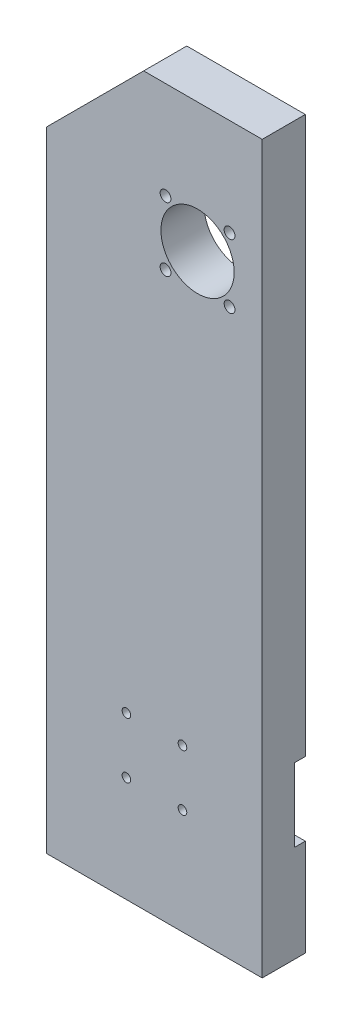
ISO-10303-21;
HEADER;
FILE_DESCRIPTION(('STEP AP214'),'2;1');
FILE_NAME('part.step','',(''),(''),'','','');
FILE_SCHEMA(('AUTOMOTIVE_DESIGN { 1 0 10303 214 1 1 1 1 }'));
ENDSEC;
DATA;
#1=APPLICATION_CONTEXT('core data for automotive mechanical design processes');
#2=APPLICATION_PROTOCOL_DEFINITION('international standard','automotive_design',2000,#1);
#3=PRODUCT_CONTEXT('',#1,'mechanical');
#4=PRODUCT('Part','Part','',(#3));
#5=PRODUCT_RELATED_PRODUCT_CATEGORY('part','',(#4));
#6=PRODUCT_DEFINITION_FORMATION('','',#4);
#7=PRODUCT_DEFINITION_CONTEXT('part definition',#1,'design');
#8=PRODUCT_DEFINITION('design','',#6,#7);
#9=PRODUCT_DEFINITION_SHAPE('','',#8);
#10=(LENGTH_UNIT() NAMED_UNIT(*) SI_UNIT(.MILLI.,.METRE.));
#11=(NAMED_UNIT(*) PLANE_ANGLE_UNIT() SI_UNIT($,.RADIAN.));
#12=(NAMED_UNIT(*) SI_UNIT($,.STERADIAN.) SOLID_ANGLE_UNIT());
#13=UNCERTAINTY_MEASURE_WITH_UNIT(LENGTH_MEASURE(1.E-05),#10,'distance_accuracy_value','');
#14=(GEOMETRIC_REPRESENTATION_CONTEXT(3) GLOBAL_UNCERTAINTY_ASSIGNED_CONTEXT((#13)) GLOBAL_UNIT_ASSIGNED_CONTEXT((#10,
#11,#12)) REPRESENTATION_CONTEXT('',''));
#15=CARTESIAN_POINT('',(0.,0.,0.));
#16=DIRECTION('',(0.,0.,1.));
#17=DIRECTION('',(1.,0.,0.));
#18=AXIS2_PLACEMENT_3D('',#15,#16,#17);
#19=CARTESIAN_POINT('',(0.,0.,0.));
#20=DIRECTION('',(0.,0.,1.));
#21=DIRECTION('',(1.,0.,0.));
#22=AXIS2_PLACEMENT_3D('',#19,#20,#21);
#23=PLANE('',#22);
#24=DIRECTION('',(1.,0.,0.));
#25=VECTOR('',#24,1.);
#26=CARTESIAN_POINT('',(97.7045460620289,328.500370418681,0.));
#27=LINE('',#26,#25);
#28=CARTESIAN_POINT('',(-2.29545393797106,328.500370418681,0.));
#29=VERTEX_POINT('',#28);
#30=CARTESIAN_POINT('',(97.7045460620289,328.500370418681,0.));
#31=VERTEX_POINT('',#30);
#32=EDGE_CURVE('E118',#29,#31,#27,.T.);
#33=ORIENTED_EDGE('',*,*,#32,.T.);
#34=DIRECTION('',(0.,1.,0.));
#35=VECTOR('',#34,1.);
#36=CARTESIAN_POINT('',(97.7045460620289,283.500370418681,0.));
#37=LINE('',#36,#35);
#38=CARTESIAN_POINT('',(97.7045460620289,283.500370418681,0.));
#39=VERTEX_POINT('',#38);
#40=EDGE_CURVE('E206',#39,#31,#37,.T.);
#41=ORIENTED_EDGE('',*,*,#40,.F.);
#42=DIRECTION('',(1.,0.,0.));
#43=VECTOR('',#42,1.);
#44=CARTESIAN_POINT('',(97.7045460620289,283.500370418681,0.));
#45=LINE('',#44,#43);
#46=CARTESIAN_POINT('',(-2.29545393797106,283.500370418681,0.));
#47=VERTEX_POINT('',#46);
#48=EDGE_CURVE('E203',#47,#39,#45,.T.);
#49=ORIENTED_EDGE('',*,*,#48,.F.);
#50=DIRECTION('',(0.,-1.,0.));
#51=VECTOR('',#50,1.);
#52=CARTESIAN_POINT('',(-2.29545393797106,283.500370418681,0.));
#53=LINE('',#52,#51);
#54=EDGE_CURVE('E188',#29,#47,#53,.T.);
#55=ORIENTED_EDGE('',*,*,#54,.F.);
#56=EDGE_LOOP('',(#33,#41,#49,#55));
#57=FACE_BOUND('',#56,.T.);
#58=ADVANCED_FACE('F33',(#57),#23,.F.);
#59=CARTESIAN_POINT('',(52.8553036571115,575.349612823599,0.));
#60=DIRECTION('',(0.,0.,1.));
#61=DIRECTION('',(1.,0.,0.));
#62=AXIS2_PLACEMENT_3D('',#59,#60,#61);
#63=CIRCLE('',#62,2.50000000000003);
#64=CARTESIAN_POINT('',(55.3553036571115,575.349612823599,0.));
#65=VERTEX_POINT('',#64);
#66=EDGE_CURVE('E160',#65,#65,#63,.T.);
#67=ORIENTED_EDGE('',*,*,#66,.T.);
#68=EDGE_LOOP('',(#67));
#69=FACE_BOUND('',#68,.T.);
#70=CARTESIAN_POINT('',(52.8553036571115,545.651128013763,0.));
#71=DIRECTION('',(0.,0.,1.));
#72=DIRECTION('',(1.,0.,0.));
#73=AXIS2_PLACEMENT_3D('',#70,#71,#72);
#74=CIRCLE('',#73,2.5);
#75=CARTESIAN_POINT('',(55.3553036571115,545.651128013763,0.));
#76=VERTEX_POINT('',#75);
#77=EDGE_CURVE('E164',#76,#76,#74,.T.);
#78=ORIENTED_EDGE('',*,*,#77,.T.);
#79=EDGE_LOOP('',(#78));
#80=FACE_BOUND('',#79,.T.);
#81=CARTESIAN_POINT('',(82.5537884669464,545.651128013763,0.));
#82=DIRECTION('',(0.,0.,1.));
#83=DIRECTION('',(1.,0.,0.));
#84=AXIS2_PLACEMENT_3D('',#81,#82,#83);
#85=CIRCLE('',#84,2.50000000000001);
#86=CARTESIAN_POINT('',(85.0537884669464,545.651128013763,0.));
#87=VERTEX_POINT('',#86);
#88=EDGE_CURVE('E170',#87,#87,#85,.T.);
#89=ORIENTED_EDGE('',*,*,#88,.T.);
#90=EDGE_LOOP('',(#89));
#91=FACE_BOUND('',#90,.T.);
#92=CARTESIAN_POINT('',(82.5537884669464,575.349612823599,0.));
#93=DIRECTION('',(0.,0.,1.));
#94=DIRECTION('',(1.,0.,0.));
#95=AXIS2_PLACEMENT_3D('',#92,#93,#94);
#96=CIRCLE('',#95,2.50000000000001);
#97=CARTESIAN_POINT('',(85.0537884669464,575.349612823599,0.));
#98=VERTEX_POINT('',#97);
#99=EDGE_CURVE('E176',#98,#98,#96,.T.);
#100=ORIENTED_EDGE('',*,*,#99,.T.);
#101=EDGE_LOOP('',(#100));
#102=FACE_BOUND('',#101,.T.);
#103=CARTESIAN_POINT('',(67.7045460620289,560.500370418681,0.));
#104=DIRECTION('',(0.,0.,1.));
#105=DIRECTION('',(1.,0.,0.));
#106=AXIS2_PLACEMENT_3D('',#103,#104,#105);
#107=CIRCLE('',#106,17.0000000000001);
#108=CARTESIAN_POINT('',(84.704546062029,560.500370418681,0.));
#109=VERTEX_POINT('',#108);
#110=EDGE_CURVE('E182',#109,#109,#107,.T.);
#111=ORIENTED_EDGE('',*,*,#110,.T.);
#112=EDGE_LOOP('',(#111));
#113=FACE_BOUND('',#112,.T.);
#114=DIRECTION('',(-1.,0.,0.));
#115=VECTOR('',#114,1.);
#116=CARTESIAN_POINT('',(97.704546062029,362.500370418681,0.));
#117=LINE('',#116,#115);
#118=CARTESIAN_POINT('',(97.704546062029,362.500370418681,0.));
#119=VERTEX_POINT('',#118);
#120=CARTESIAN_POINT('',(-2.29545393797106,362.500370418681,0.));
#121=VERTEX_POINT('',#120);
#122=EDGE_CURVE('E126',#119,#121,#117,.T.);
#123=ORIENTED_EDGE('',*,*,#122,.T.);
#124=CARTESIAN_POINT('',(-2.29545393797106,575.500370418681,0.));
#125=VERTEX_POINT('',#124);
#126=EDGE_CURVE('E201',#125,#121,#53,.T.);
#127=ORIENTED_EDGE('',*,*,#126,.F.);
#128=DIRECTION('',(-0.707106781186548,-0.707106781186547,0.));
#129=VECTOR('',#128,1.);
#130=CARTESIAN_POINT('',(-2.29545393797106,575.500370418681,0.));
#131=LINE('',#130,#129);
#132=CARTESIAN_POINT('',(42.704546062029,620.500370418681,0.));
#133=VERTEX_POINT('',#132);
#134=EDGE_CURVE('E221',#125,#133,#131,.F.);
#135=ORIENTED_EDGE('',*,*,#134,.T.);
#136=DIRECTION('',(-1.,0.,0.));
#137=VECTOR('',#136,1.);
#138=CARTESIAN_POINT('',(97.7045460620289,620.500370418681,0.));
#139=LINE('',#138,#137);
#140=CARTESIAN_POINT('',(97.7045460620289,620.500370418681,0.));
#141=VERTEX_POINT('',#140);
#142=EDGE_CURVE('E194',#141,#133,#139,.T.);
#143=ORIENTED_EDGE('',*,*,#142,.F.);
#144=EDGE_CURVE('E205',#119,#141,#37,.T.);
#145=ORIENTED_EDGE('',*,*,#144,.F.);
#146=EDGE_LOOP('',(#123,#127,#135,#143,#145));
#147=FACE_BOUND('',#146,.T.);
#148=ADVANCED_FACE('F226',(#69,#80,#91,#102,#113,#147),#23,.F.);
#149=CARTESIAN_POINT('',(-2.29545393797106,283.500370418681,20.));
#150=DIRECTION('',(1.,0.,0.));
#151=DIRECTION('',(0.,0.,-1.));
#152=AXIS2_PLACEMENT_3D('',#149,#150,#151);
#153=PLANE('',#152);
#154=DIRECTION('',(0.,0.,-1.));
#155=VECTOR('',#154,1.);
#156=CARTESIAN_POINT('',(-2.29545393797106,328.500370418681,5.));
#157=LINE('',#156,#155);
#158=CARTESIAN_POINT('',(-2.29545393797106,328.500370418681,5.));
#159=VERTEX_POINT('',#158);
#160=EDGE_CURVE('E115',#159,#29,#157,.T.);
#161=ORIENTED_EDGE('',*,*,#160,.T.);
#162=ORIENTED_EDGE('',*,*,#54,.T.);
#163=DIRECTION('',(0.,0.,-1.));
#164=VECTOR('',#163,1.);
#165=CARTESIAN_POINT('',(-2.29545393797106,283.500370418681,20.));
#166=LINE('',#165,#164);
#167=CARTESIAN_POINT('',(-2.29545393797106,283.500370418681,20.));
#168=VERTEX_POINT('',#167);
#169=EDGE_CURVE('E215',#168,#47,#166,.T.);
#170=ORIENTED_EDGE('',*,*,#169,.F.);
#171=DIRECTION('',(0.,-1.,0.));
#172=VECTOR('',#171,1.);
#173=CARTESIAN_POINT('',(-2.29545393797106,283.500370418681,20.));
#174=LINE('',#173,#172);
#175=CARTESIAN_POINT('',(-2.29545393797102,575.500370418681,20.));
#176=VERTEX_POINT('',#175);
#177=EDGE_CURVE('E191',#176,#168,#174,.T.);
#178=ORIENTED_EDGE('',*,*,#177,.F.);
#179=DIRECTION('',(0.,0.,-1.));
#180=VECTOR('',#179,1.);
#181=CARTESIAN_POINT('',(-2.29545393797106,575.500370418681,20.));
#182=LINE('',#181,#180);
#183=EDGE_CURVE('E218',#176,#125,#182,.T.);
#184=ORIENTED_EDGE('',*,*,#183,.T.);
#185=ORIENTED_EDGE('',*,*,#126,.T.);
#186=DIRECTION('',(0.,0.,-1.));
#187=VECTOR('',#186,1.);
#188=CARTESIAN_POINT('',(-2.29545393797106,362.500370418681,5.));
#189=LINE('',#188,#187);
#190=CARTESIAN_POINT('',(-2.29545393797106,362.500370418681,5.));
#191=VERTEX_POINT('',#190);
#192=EDGE_CURVE('E125',#191,#121,#189,.T.);
#193=ORIENTED_EDGE('',*,*,#192,.F.);
#194=DIRECTION('',(0.,-1.,0.));
#195=VECTOR('',#194,1.);
#196=CARTESIAN_POINT('',(-2.29545393797106,328.500370418681,5.));
#197=LINE('',#196,#195);
#198=EDGE_CURVE('E107',#191,#159,#197,.T.);
#199=ORIENTED_EDGE('',*,*,#198,.T.);
#200=EDGE_LOOP('',(#161,#162,#170,#178,#184,#185,#193,#199));
#201=FACE_BOUND('',#200,.T.);
#202=ADVANCED_FACE('F123',(#201),#153,.F.);
#203=CARTESIAN_POINT('',(97.7045460620289,283.500370418681,20.));
#204=DIRECTION('',(-1.,0.,0.));
#205=DIRECTION('',(0.,0.,1.));
#206=AXIS2_PLACEMENT_3D('',#203,#204,#205);
#207=PLANE('',#206);
#208=DIRECTION('',(0.,0.,-1.));
#209=VECTOR('',#208,1.);
#210=CARTESIAN_POINT('',(97.7045460620289,328.500370418681,5.));
#211=LINE('',#210,#209);
#212=CARTESIAN_POINT('',(97.7045460620289,328.500370418681,5.));
#213=VERTEX_POINT('',#212);
#214=EDGE_CURVE('E121',#213,#31,#211,.T.);
#215=ORIENTED_EDGE('',*,*,#214,.F.);
#216=DIRECTION('',(0.,1.,0.));
#217=VECTOR('',#216,1.);
#218=CARTESIAN_POINT('',(97.7045460620289,328.500370418681,5.));
#219=LINE('',#218,#217);
#220=CARTESIAN_POINT('',(97.7045460620289,362.500370418681,5.));
#221=VERTEX_POINT('',#220);
#222=EDGE_CURVE('E110',#213,#221,#219,.T.);
#223=ORIENTED_EDGE('',*,*,#222,.T.);
#224=DIRECTION('',(0.,0.,-1.));
#225=VECTOR('',#224,1.);
#226=CARTESIAN_POINT('',(97.704546062029,362.500370418681,5.));
#227=LINE('',#226,#225);
#228=EDGE_CURVE('E135',#221,#119,#227,.T.);
#229=ORIENTED_EDGE('',*,*,#228,.T.);
#230=ORIENTED_EDGE('',*,*,#144,.T.);
#231=DIRECTION('',(0.,0.,-1.));
#232=VECTOR('',#231,1.);
#233=CARTESIAN_POINT('',(97.7045460620289,620.500370418681,20.));
#234=LINE('',#233,#232);
#235=CARTESIAN_POINT('',(97.7045460620289,620.500370418681,20.));
#236=VERTEX_POINT('',#235);
#237=EDGE_CURVE('E200',#236,#141,#234,.T.);
#238=ORIENTED_EDGE('',*,*,#237,.F.);
#239=DIRECTION('',(0.,1.,0.));
#240=VECTOR('',#239,1.);
#241=CARTESIAN_POINT('',(97.7045460620289,283.500370418681,20.));
#242=LINE('',#241,#240);
#243=CARTESIAN_POINT('',(97.7045460620289,283.500370418681,20.));
#244=VERTEX_POINT('',#243);
#245=EDGE_CURVE('E196',#244,#236,#242,.T.);
#246=ORIENTED_EDGE('',*,*,#245,.F.);
#247=DIRECTION('',(0.,0.,-1.));
#248=VECTOR('',#247,1.);
#249=CARTESIAN_POINT('',(97.7045460620289,283.500370418681,20.));
#250=LINE('',#249,#248);
#251=EDGE_CURVE('E212',#244,#39,#250,.T.);
#252=ORIENTED_EDGE('',*,*,#251,.T.);
#253=ORIENTED_EDGE('',*,*,#40,.T.);
#254=EDGE_LOOP('',(#215,#223,#229,#230,#238,#246,#252,#253));
#255=FACE_BOUND('',#254,.T.);
#256=ADVANCED_FACE('F245',(#255),#207,.F.);
#257=CARTESIAN_POINT('',(0.,0.,20.));
#258=DIRECTION('',(0.,0.,1.));
#259=DIRECTION('',(1.,0.,0.));
#260=AXIS2_PLACEMENT_3D('',#257,#258,#259);
#261=PLANE('',#260);
#262=CARTESIAN_POINT('',(60.7045460620289,332.500370418681,20.));
#263=DIRECTION('',(0.,0.,1.));
#264=DIRECTION('',(1.,0.,0.));
#265=AXIS2_PLACEMENT_3D('',#262,#263,#264);
#266=CIRCLE('',#265,2.);
#267=CARTESIAN_POINT('',(62.7045460620289,332.500370418681,20.));
#268=VERTEX_POINT('',#267);
#269=EDGE_CURVE('E151',#268,#268,#266,.T.);
#270=ORIENTED_EDGE('',*,*,#269,.F.);
#271=EDGE_LOOP('',(#270));
#272=FACE_BOUND('',#271,.T.);
#273=CARTESIAN_POINT('',(34.7045460620289,358.500370418681,20.));
#274=DIRECTION('',(0.,0.,1.));
#275=DIRECTION('',(1.,0.,0.));
#276=AXIS2_PLACEMENT_3D('',#273,#274,#275);
#277=CIRCLE('',#276,2.00000000000001);
#278=CARTESIAN_POINT('',(36.7045460620289,358.500370418681,20.));
#279=VERTEX_POINT('',#278);
#280=EDGE_CURVE('E157',#279,#279,#277,.T.);
#281=ORIENTED_EDGE('',*,*,#280,.F.);
#282=EDGE_LOOP('',(#281));
#283=FACE_BOUND('',#282,.T.);
#284=CARTESIAN_POINT('',(52.8553036571115,545.651128013763,20.));
#285=DIRECTION('',(0.,0.,1.));
#286=DIRECTION('',(1.,0.,0.));
#287=AXIS2_PLACEMENT_3D('',#284,#285,#286);
#288=CIRCLE('',#287,2.5);
#289=CARTESIAN_POINT('',(55.3553036571115,545.651128013763,20.));
#290=VERTEX_POINT('',#289);
#291=EDGE_CURVE('E167',#290,#290,#288,.T.);
#292=ORIENTED_EDGE('',*,*,#291,.F.);
#293=EDGE_LOOP('',(#292));
#294=FACE_BOUND('',#293,.T.);
#295=CARTESIAN_POINT('',(82.5537884669464,575.349612823599,20.));
#296=DIRECTION('',(0.,0.,1.));
#297=DIRECTION('',(1.,0.,0.));
#298=AXIS2_PLACEMENT_3D('',#295,#296,#297);
#299=CIRCLE('',#298,2.50000000000001);
#300=CARTESIAN_POINT('',(85.0537884669464,575.349612823599,20.));
#301=VERTEX_POINT('',#300);
#302=EDGE_CURVE('E179',#301,#301,#299,.T.);
#303=ORIENTED_EDGE('',*,*,#302,.F.);
#304=EDGE_LOOP('',(#303));
#305=FACE_BOUND('',#304,.T.);
#306=DIRECTION('',(-1.,0.,0.));
#307=VECTOR('',#306,1.);
#308=CARTESIAN_POINT('',(97.7045460620289,620.500370418681,20.));
#309=LINE('',#308,#307);
#310=CARTESIAN_POINT('',(42.7045460620291,620.500370418681,20.));
#311=VERTEX_POINT('',#310);
#312=EDGE_CURVE('E198',#236,#311,#309,.T.);
#313=ORIENTED_EDGE('',*,*,#312,.T.);
#314=DIRECTION('',(0.707106781186548,0.707106781186547,0.));
#315=VECTOR('',#314,1.);
#316=CARTESIAN_POINT('',(-288.897912178326,288.897912178326,20.));
#317=LINE('',#316,#315);
#318=EDGE_CURVE('E11',#311,#176,#317,.F.);
#319=ORIENTED_EDGE('',*,*,#318,.T.);
#320=ORIENTED_EDGE('',*,*,#177,.T.);
#321=DIRECTION('',(1.,0.,0.));
#322=VECTOR('',#321,1.);
#323=CARTESIAN_POINT('',(97.7045460620289,283.500370418681,20.));
#324=LINE('',#323,#322);
#325=EDGE_CURVE('E193',#168,#244,#324,.T.);
#326=ORIENTED_EDGE('',*,*,#325,.T.);
#327=ORIENTED_EDGE('',*,*,#245,.T.);
#328=EDGE_LOOP('',(#313,#319,#320,#326,#327));
#329=FACE_BOUND('',#328,.T.);
#330=CARTESIAN_POINT('',(67.7045460620289,560.500370418681,20.));
#331=DIRECTION('',(0.,0.,1.));
#332=DIRECTION('',(1.,0.,0.));
#333=AXIS2_PLACEMENT_3D('',#330,#331,#332);
#334=CIRCLE('',#333,17.0000000000001);
#335=CARTESIAN_POINT('',(84.704546062029,560.500370418681,20.));
#336=VERTEX_POINT('',#335);
#337=EDGE_CURVE('E185',#336,#336,#334,.T.);
#338=ORIENTED_EDGE('',*,*,#337,.F.);
#339=EDGE_LOOP('',(#338));
#340=FACE_BOUND('',#339,.T.);
#341=CARTESIAN_POINT('',(82.5537884669464,545.651128013763,20.));
#342=DIRECTION('',(0.,0.,1.));
#343=DIRECTION('',(1.,0.,0.));
#344=AXIS2_PLACEMENT_3D('',#341,#342,#343);
#345=CIRCLE('',#344,2.50000000000001);
#346=CARTESIAN_POINT('',(85.0537884669464,545.651128013763,20.));
#347=VERTEX_POINT('',#346);
#348=EDGE_CURVE('E173',#347,#347,#345,.T.);
#349=ORIENTED_EDGE('',*,*,#348,.F.);
#350=EDGE_LOOP('',(#349));
#351=FACE_BOUND('',#350,.T.);
#352=CARTESIAN_POINT('',(52.8553036571115,575.349612823599,20.));
#353=DIRECTION('',(0.,0.,1.));
#354=DIRECTION('',(1.,0.,0.));
#355=AXIS2_PLACEMENT_3D('',#352,#353,#354);
#356=CIRCLE('',#355,2.50000000000003);
#357=CARTESIAN_POINT('',(55.3553036571115,575.349612823599,20.));
#358=VERTEX_POINT('',#357);
#359=EDGE_CURVE('E161',#358,#358,#356,.T.);
#360=ORIENTED_EDGE('',*,*,#359,.F.);
#361=EDGE_LOOP('',(#360));
#362=FACE_BOUND('',#361,.T.);
#363=CARTESIAN_POINT('',(60.7045460620289,358.500370418681,20.));
#364=DIRECTION('',(0.,0.,1.));
#365=DIRECTION('',(-1.,0.,0.));
#366=AXIS2_PLACEMENT_3D('',#363,#364,#365);
#367=CIRCLE('',#366,2.);
#368=CARTESIAN_POINT('',(58.7045460620289,358.500370418681,20.));
#369=VERTEX_POINT('',#368);
#370=EDGE_CURVE('E154',#369,#369,#367,.T.);
#371=ORIENTED_EDGE('',*,*,#370,.F.);
#372=EDGE_LOOP('',(#371));
#373=FACE_BOUND('',#372,.T.);
#374=CARTESIAN_POINT('',(34.7045460620289,332.500370418681,20.));
#375=DIRECTION('',(0.,0.,1.));
#376=DIRECTION('',(-1.,0.,0.));
#377=AXIS2_PLACEMENT_3D('',#374,#375,#376);
#378=CIRCLE('',#377,2.00000000000001);
#379=CARTESIAN_POINT('',(32.7045460620289,332.500370418681,20.));
#380=VERTEX_POINT('',#379);
#381=EDGE_CURVE('E148',#380,#380,#378,.T.);
#382=ORIENTED_EDGE('',*,*,#381,.F.);
#383=EDGE_LOOP('',(#382));
#384=FACE_BOUND('',#383,.T.);
#385=ADVANCED_FACE('F235',(#272,#283,#294,#305,#329,#340,#351,#362,#373,#384),#261,.T.);
#386=CARTESIAN_POINT('',(97.7045460620289,283.500370418681,20.));
#387=DIRECTION('',(0.,1.,0.));
#388=DIRECTION('',(0.,0.,1.));
#389=AXIS2_PLACEMENT_3D('',#386,#387,#388);
#390=PLANE('',#389);
#391=ORIENTED_EDGE('',*,*,#48,.T.);
#392=ORIENTED_EDGE('',*,*,#251,.F.);
#393=ORIENTED_EDGE('',*,*,#325,.F.);
#394=ORIENTED_EDGE('',*,*,#169,.T.);
#395=EDGE_LOOP('',(#391,#392,#393,#394));
#396=FACE_BOUND('',#395,.T.);
#397=ADVANCED_FACE('F241',(#396),#390,.F.);
#398=CARTESIAN_POINT('',(97.7045460620289,620.500370418681,20.));
#399=DIRECTION('',(0.,-1.,0.));
#400=DIRECTION('',(0.,0.,-1.));
#401=AXIS2_PLACEMENT_3D('',#398,#399,#400);
#402=PLANE('',#401);
#403=ORIENTED_EDGE('',*,*,#142,.T.);
#404=DIRECTION('',(0.,0.,1.));
#405=VECTOR('',#404,1.);
#406=CARTESIAN_POINT('',(42.704546062029,620.500370418681,20.));
#407=LINE('',#406,#405);
#408=EDGE_CURVE('E42',#133,#311,#407,.T.);
#409=ORIENTED_EDGE('',*,*,#408,.T.);
#410=ORIENTED_EDGE('',*,*,#312,.F.);
#411=ORIENTED_EDGE('',*,*,#237,.T.);
#412=EDGE_LOOP('',(#403,#409,#410,#411));
#413=FACE_BOUND('',#412,.T.);
#414=ADVANCED_FACE('F230',(#413),#402,.F.);
#415=CARTESIAN_POINT('',(67.7045460620289,560.500370418681,20.));
#416=DIRECTION('',(0.,0.,-1.));
#417=DIRECTION('',(-1.,0.,0.));
#418=AXIS2_PLACEMENT_3D('',#415,#416,#417);
#419=CYLINDRICAL_SURFACE('',#418,17.0000000000001);
#420=ORIENTED_EDGE('',*,*,#337,.T.);
#421=EDGE_LOOP('',(#420));
#422=FACE_BOUND('',#421,.T.);
#423=ORIENTED_EDGE('',*,*,#110,.F.);
#424=EDGE_LOOP('',(#423));
#425=FACE_BOUND('',#424,.T.);
#426=ADVANCED_FACE('F261',(#422,#425),#419,.F.);
#427=CARTESIAN_POINT('',(82.5537884669464,575.349612823599,20.));
#428=DIRECTION('',(0.,0.,-1.));
#429=DIRECTION('',(-1.,0.,0.));
#430=AXIS2_PLACEMENT_3D('',#427,#428,#429);
#431=CYLINDRICAL_SURFACE('',#430,2.50000000000001);
#432=ORIENTED_EDGE('',*,*,#302,.T.);
#433=EDGE_LOOP('',(#432));
#434=FACE_BOUND('',#433,.T.);
#435=ORIENTED_EDGE('',*,*,#99,.F.);
#436=EDGE_LOOP('',(#435));
#437=FACE_BOUND('',#436,.T.);
#438=ADVANCED_FACE('F297',(#434,#437),#431,.F.);
#439=CARTESIAN_POINT('',(82.5537884669464,545.651128013763,20.));
#440=DIRECTION('',(0.,0.,-1.));
#441=DIRECTION('',(-1.,0.,0.));
#442=AXIS2_PLACEMENT_3D('',#439,#440,#441);
#443=CYLINDRICAL_SURFACE('',#442,2.50000000000001);
#444=ORIENTED_EDGE('',*,*,#348,.T.);
#445=EDGE_LOOP('',(#444));
#446=FACE_BOUND('',#445,.T.);
#447=ORIENTED_EDGE('',*,*,#88,.F.);
#448=EDGE_LOOP('',(#447));
#449=FACE_BOUND('',#448,.T.);
#450=ADVANCED_FACE('F304',(#446,#449),#443,.F.);
#451=CARTESIAN_POINT('',(52.8553036571115,545.651128013763,20.));
#452=DIRECTION('',(0.,0.,-1.));
#453=DIRECTION('',(-1.,0.,0.));
#454=AXIS2_PLACEMENT_3D('',#451,#452,#453);
#455=CYLINDRICAL_SURFACE('',#454,2.5);
#456=ORIENTED_EDGE('',*,*,#291,.T.);
#457=EDGE_LOOP('',(#456));
#458=FACE_BOUND('',#457,.T.);
#459=ORIENTED_EDGE('',*,*,#77,.F.);
#460=EDGE_LOOP('',(#459));
#461=FACE_BOUND('',#460,.T.);
#462=ADVANCED_FACE('F312',(#458,#461),#455,.F.);
#463=CARTESIAN_POINT('',(52.8553036571115,575.349612823599,20.));
#464=DIRECTION('',(0.,0.,-1.));
#465=DIRECTION('',(-1.,0.,0.));
#466=AXIS2_PLACEMENT_3D('',#463,#464,#465);
#467=CYLINDRICAL_SURFACE('',#466,2.50000000000003);
#468=ORIENTED_EDGE('',*,*,#359,.T.);
#469=EDGE_LOOP('',(#468));
#470=FACE_BOUND('',#469,.T.);
#471=ORIENTED_EDGE('',*,*,#66,.F.);
#472=EDGE_LOOP('',(#471));
#473=FACE_BOUND('',#472,.T.);
#474=ADVANCED_FACE('F320',(#470,#473),#467,.F.);
#475=CARTESIAN_POINT('',(34.7045460620289,358.500370418681,20.));
#476=DIRECTION('',(0.,0.,-1.));
#477=DIRECTION('',(-1.,0.,0.));
#478=AXIS2_PLACEMENT_3D('',#475,#476,#477);
#479=CYLINDRICAL_SURFACE('',#478,2.00000000000001);
#480=CARTESIAN_POINT('',(34.7045460620289,358.500370418681,5.));
#481=DIRECTION('',(0.,0.,1.));
#482=DIRECTION('',(1.,0.,0.));
#483=AXIS2_PLACEMENT_3D('',#480,#481,#482);
#484=CIRCLE('',#483,2.00000000000001);
#485=CARTESIAN_POINT('',(36.7045460620289,358.500370418681,5.));
#486=VERTEX_POINT('',#485);
#487=EDGE_CURVE('E145',#486,#486,#484,.T.);
#488=ORIENTED_EDGE('',*,*,#487,.F.);
#489=EDGE_LOOP('',(#488));
#490=FACE_BOUND('',#489,.T.);
#491=ORIENTED_EDGE('',*,*,#280,.T.);
#492=EDGE_LOOP('',(#491));
#493=FACE_BOUND('',#492,.T.);
#494=ADVANCED_FACE('F327',(#490,#493),#479,.F.);
#495=CARTESIAN_POINT('',(60.7045460620289,358.500370418681,20.));
#496=DIRECTION('',(0.,0.,-1.));
#497=DIRECTION('',(-1.,0.,0.));
#498=AXIS2_PLACEMENT_3D('',#495,#496,#497);
#499=CYLINDRICAL_SURFACE('',#498,2.);
#500=CARTESIAN_POINT('',(60.7045460620289,358.500370418681,5.));
#501=DIRECTION('',(0.,0.,1.));
#502=DIRECTION('',(1.,0.,0.));
#503=AXIS2_PLACEMENT_3D('',#500,#501,#502);
#504=CIRCLE('',#503,2.);
#505=CARTESIAN_POINT('',(62.7045460620289,358.500370418681,5.));
#506=VERTEX_POINT('',#505);
#507=EDGE_CURVE('E142',#506,#506,#504,.T.);
#508=ORIENTED_EDGE('',*,*,#507,.F.);
#509=EDGE_LOOP('',(#508));
#510=FACE_BOUND('',#509,.T.);
#511=ORIENTED_EDGE('',*,*,#370,.T.);
#512=EDGE_LOOP('',(#511));
#513=FACE_BOUND('',#512,.T.);
#514=ADVANCED_FACE('F334',(#510,#513),#499,.F.);
#515=CARTESIAN_POINT('',(60.7045460620289,332.500370418681,20.));
#516=DIRECTION('',(0.,0.,-1.));
#517=DIRECTION('',(-1.,0.,0.));
#518=AXIS2_PLACEMENT_3D('',#515,#516,#517);
#519=CYLINDRICAL_SURFACE('',#518,2.);
#520=CARTESIAN_POINT('',(60.7045460620289,332.500370418681,5.));
#521=DIRECTION('',(0.,0.,1.));
#522=DIRECTION('',(1.,0.,0.));
#523=AXIS2_PLACEMENT_3D('',#520,#521,#522);
#524=CIRCLE('',#523,2.);
#525=CARTESIAN_POINT('',(62.7045460620289,332.500370418681,5.));
#526=VERTEX_POINT('',#525);
#527=EDGE_CURVE('E139',#526,#526,#524,.T.);
#528=ORIENTED_EDGE('',*,*,#527,.F.);
#529=EDGE_LOOP('',(#528));
#530=FACE_BOUND('',#529,.T.);
#531=ORIENTED_EDGE('',*,*,#269,.T.);
#532=EDGE_LOOP('',(#531));
#533=FACE_BOUND('',#532,.T.);
#534=ADVANCED_FACE('F342',(#530,#533),#519,.F.);
#535=CARTESIAN_POINT('',(34.7045460620289,332.500370418681,20.));
#536=DIRECTION('',(0.,0.,-1.));
#537=DIRECTION('',(-1.,0.,0.));
#538=AXIS2_PLACEMENT_3D('',#535,#536,#537);
#539=CYLINDRICAL_SURFACE('',#538,2.00000000000001);
#540=CARTESIAN_POINT('',(34.7045460620289,332.500370418681,5.));
#541=DIRECTION('',(0.,0.,1.));
#542=DIRECTION('',(1.,0.,0.));
#543=AXIS2_PLACEMENT_3D('',#540,#541,#542);
#544=CIRCLE('',#543,2.00000000000001);
#545=CARTESIAN_POINT('',(36.7045460620289,332.500370418681,5.));
#546=VERTEX_POINT('',#545);
#547=EDGE_CURVE('E37',#546,#546,#544,.T.);
#548=ORIENTED_EDGE('',*,*,#547,.F.);
#549=EDGE_LOOP('',(#548));
#550=FACE_BOUND('',#549,.T.);
#551=ORIENTED_EDGE('',*,*,#381,.T.);
#552=EDGE_LOOP('',(#551));
#553=FACE_BOUND('',#552,.T.);
#554=ADVANCED_FACE('F350',(#550,#553),#539,.F.);
#555=CARTESIAN_POINT('',(-2.29545393797106,575.500370418681,20.));
#556=DIRECTION('',(0.707106781186547,-0.707106781186548,0.));
#557=DIRECTION('',(0.,0.,-1.));
#558=AXIS2_PLACEMENT_3D('',#555,#556,#557);
#559=PLANE('',#558);
#560=ORIENTED_EDGE('',*,*,#318,.F.);
#561=ORIENTED_EDGE('',*,*,#408,.F.);
#562=ORIENTED_EDGE('',*,*,#134,.F.);
#563=ORIENTED_EDGE('',*,*,#183,.F.);
#564=EDGE_LOOP('',(#560,#561,#562,#563));
#565=FACE_BOUND('',#564,.T.);
#566=ADVANCED_FACE('F35',(#565),#559,.F.);
#567=CARTESIAN_POINT('',(97.7045460620289,328.500370418681,5.));
#568=DIRECTION('',(0.,1.,0.));
#569=DIRECTION('',(0.,0.,1.));
#570=AXIS2_PLACEMENT_3D('',#567,#568,#569);
#571=PLANE('',#570);
#572=ORIENTED_EDGE('',*,*,#32,.F.);
#573=ORIENTED_EDGE('',*,*,#160,.F.);
#574=DIRECTION('',(1.,0.,0.));
#575=VECTOR('',#574,1.);
#576=CARTESIAN_POINT('',(97.7045460620289,328.500370418681,5.));
#577=LINE('',#576,#575);
#578=EDGE_CURVE('E103',#159,#213,#577,.T.);
#579=ORIENTED_EDGE('',*,*,#578,.T.);
#580=ORIENTED_EDGE('',*,*,#214,.T.);
#581=EDGE_LOOP('',(#572,#573,#579,#580));
#582=FACE_BOUND('',#581,.T.);
#583=ADVANCED_FACE('F116',(#582),#571,.T.);
#584=CARTESIAN_POINT('',(97.704546062029,362.500370418681,5.));
#585=DIRECTION('',(0.,-1.,0.));
#586=DIRECTION('',(0.,0.,-1.));
#587=AXIS2_PLACEMENT_3D('',#584,#585,#586);
#588=PLANE('',#587);
#589=ORIENTED_EDGE('',*,*,#122,.F.);
#590=ORIENTED_EDGE('',*,*,#228,.F.);
#591=DIRECTION('',(-1.,0.,0.));
#592=VECTOR('',#591,1.);
#593=CARTESIAN_POINT('',(97.704546062029,362.500370418681,5.));
#594=LINE('',#593,#592);
#595=EDGE_CURVE('E49',#221,#191,#594,.T.);
#596=ORIENTED_EDGE('',*,*,#595,.T.);
#597=ORIENTED_EDGE('',*,*,#192,.T.);
#598=EDGE_LOOP('',(#589,#590,#596,#597));
#599=FACE_BOUND('',#598,.T.);
#600=ADVANCED_FACE('F247',(#599),#588,.T.);
#601=CARTESIAN_POINT('',(0.,0.,5.));
#602=DIRECTION('',(0.,0.,1.));
#603=DIRECTION('',(1.,0.,0.));
#604=AXIS2_PLACEMENT_3D('',#601,#602,#603);
#605=PLANE('',#604);
#606=ORIENTED_EDGE('',*,*,#487,.T.);
#607=EDGE_LOOP('',(#606));
#608=FACE_BOUND('',#607,.T.);
#609=ORIENTED_EDGE('',*,*,#507,.T.);
#610=EDGE_LOOP('',(#609));
#611=FACE_BOUND('',#610,.T.);
#612=ORIENTED_EDGE('',*,*,#527,.T.);
#613=EDGE_LOOP('',(#612));
#614=FACE_BOUND('',#613,.T.);
#615=ORIENTED_EDGE('',*,*,#547,.T.);
#616=EDGE_LOOP('',(#615));
#617=FACE_BOUND('',#616,.T.);
#618=ORIENTED_EDGE('',*,*,#198,.F.);
#619=ORIENTED_EDGE('',*,*,#595,.F.);
#620=ORIENTED_EDGE('',*,*,#222,.F.);
#621=ORIENTED_EDGE('',*,*,#578,.F.);
#622=EDGE_LOOP('',(#618,#619,#620,#621));
#623=FACE_BOUND('',#622,.T.);
#624=ADVANCED_FACE('F105',(#608,#611,#614,#617,#623),#605,.F.);
#625=CLOSED_SHELL('',(#58,#148,#202,#256,#385,#397,#414,#426,#438,#450,#462,#474,#494,#514,#534,
#554,#566,#583,#600,#624));
#626=MANIFOLD_SOLID_BREP('B2',#625);
#627=ADVANCED_BREP_SHAPE_REPRESENTATION('',(#18,#626),#14);
#628=SHAPE_DEFINITION_REPRESENTATION(#9,#627);
ENDSEC;
END-ISO-10303-21;
